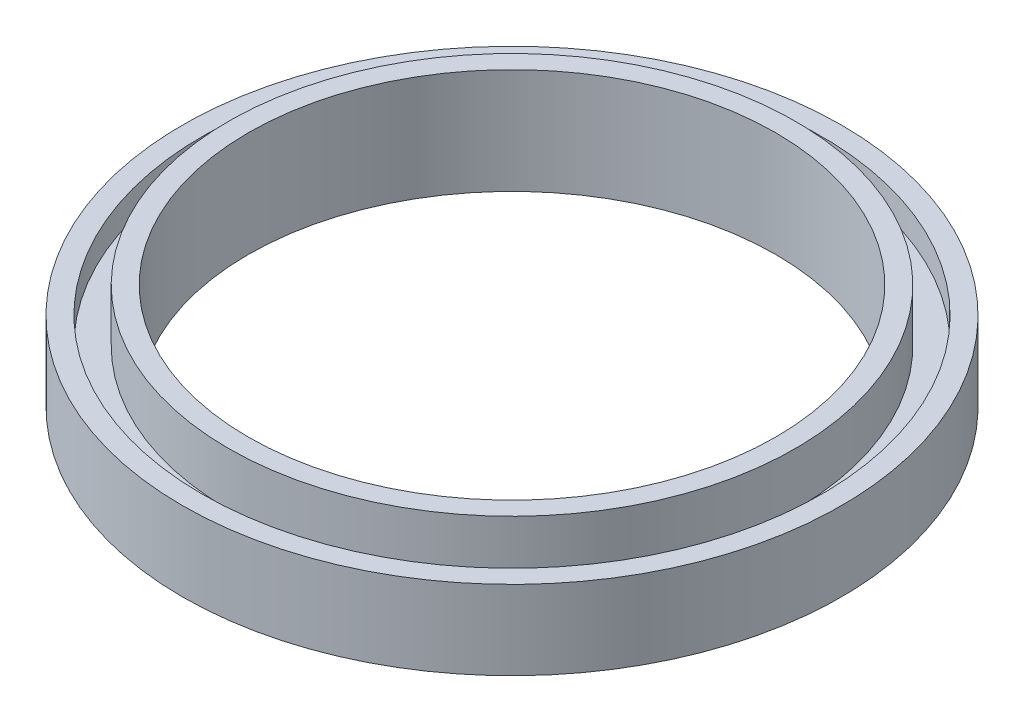
ISO-10303-21;
HEADER;
FILE_DESCRIPTION(('STEP AP214'),'2;1');
FILE_NAME('part.step','',(''),(''),'','','');
FILE_SCHEMA(('AUTOMOTIVE_DESIGN { 1 0 10303 214 1 1 1 1 }'));
ENDSEC;
DATA;
#1=APPLICATION_CONTEXT('core data for automotive mechanical design processes');
#2=APPLICATION_PROTOCOL_DEFINITION('international standard','automotive_design',2000,#1);
#3=PRODUCT_CONTEXT('',#1,'mechanical');
#4=PRODUCT('Part','Part','',(#3));
#5=PRODUCT_RELATED_PRODUCT_CATEGORY('part','',(#4));
#6=PRODUCT_DEFINITION_FORMATION('','',#4);
#7=PRODUCT_DEFINITION_CONTEXT('part definition',#1,'design');
#8=PRODUCT_DEFINITION('design','',#6,#7);
#9=PRODUCT_DEFINITION_SHAPE('','',#8);
#10=(LENGTH_UNIT() NAMED_UNIT(*) SI_UNIT(.MILLI.,.METRE.));
#11=(NAMED_UNIT(*) PLANE_ANGLE_UNIT() SI_UNIT($,.RADIAN.));
#12=(NAMED_UNIT(*) SI_UNIT($,.STERADIAN.) SOLID_ANGLE_UNIT());
#13=UNCERTAINTY_MEASURE_WITH_UNIT(LENGTH_MEASURE(1.E-05),#10,'distance_accuracy_value','');
#14=(GEOMETRIC_REPRESENTATION_CONTEXT(3) GLOBAL_UNCERTAINTY_ASSIGNED_CONTEXT((#13)) GLOBAL_UNIT_ASSIGNED_CONTEXT((#10,
#11,#12)) REPRESENTATION_CONTEXT('',''));
#15=CARTESIAN_POINT('',(0.,0.,0.));
#16=DIRECTION('',(0.,0.,1.));
#17=DIRECTION('',(1.,0.,0.));
#18=AXIS2_PLACEMENT_3D('',#15,#16,#17);
#19=CARTESIAN_POINT('',(0.,4.,0.));
#20=DIRECTION('',(0.,1.,0.));
#21=DIRECTION('',(0.,0.,1.));
#22=AXIS2_PLACEMENT_3D('',#19,#20,#21);
#23=CYLINDRICAL_SURFACE('',#22,23.5);
#24=CARTESIAN_POINT('',(0.,4.,0.));
#25=DIRECTION('',(0.,1.,0.));
#26=DIRECTION('',(0.,0.,1.));
#27=AXIS2_PLACEMENT_3D('',#24,#25,#26);
#28=CIRCLE('',#27,23.5);
#29=CARTESIAN_POINT('',(0.,4.,23.5));
#30=VERTEX_POINT('',#29);
#31=EDGE_CURVE('E44',#30,#30,#28,.T.);
#32=ORIENTED_EDGE('',*,*,#31,.F.);
#33=EDGE_LOOP('',(#32));
#34=FACE_BOUND('',#33,.T.);
#35=CARTESIAN_POINT('',(0.,6.,0.));
#36=DIRECTION('',(0.,1.,0.));
#37=DIRECTION('',(0.,0.,1.));
#38=AXIS2_PLACEMENT_3D('',#35,#36,#37);
#39=CIRCLE('',#38,23.5);
#40=CARTESIAN_POINT('',(0.,6.,23.5));
#41=VERTEX_POINT('',#40);
#42=EDGE_CURVE('E60',#41,#41,#39,.T.);
#43=ORIENTED_EDGE('',*,*,#42,.T.);
#44=EDGE_LOOP('',(#43));
#45=FACE_BOUND('',#44,.T.);
#46=ADVANCED_FACE('F37',(#34,#45),#23,.F.);
#47=CARTESIAN_POINT('',(0.,4.,0.));
#48=DIRECTION('',(0.,1.,0.));
#49=DIRECTION('',(0.,0.,1.));
#50=AXIS2_PLACEMENT_3D('',#47,#48,#49);
#51=PLANE('',#50);
#52=CARTESIAN_POINT('',(0.,4.,0.));
#53=DIRECTION('',(0.,1.,0.));
#54=DIRECTION('',(0.,0.,1.));
#55=AXIS2_PLACEMENT_3D('',#52,#53,#54);
#56=CIRCLE('',#55,21.5);
#57=CARTESIAN_POINT('',(0.,4.,21.5));
#58=VERTEX_POINT('',#57);
#59=EDGE_CURVE('E48',#58,#58,#56,.T.);
#60=ORIENTED_EDGE('',*,*,#59,.F.);
#61=EDGE_LOOP('',(#60));
#62=FACE_BOUND('',#61,.T.);
#63=ORIENTED_EDGE('',*,*,#31,.T.);
#64=EDGE_LOOP('',(#63));
#65=FACE_BOUND('',#64,.T.);
#66=ADVANCED_FACE('F82',(#62,#65),#51,.T.);
#67=CARTESIAN_POINT('',(0.,4.,0.));
#68=DIRECTION('',(0.,1.,0.));
#69=DIRECTION('',(0.,0.,1.));
#70=AXIS2_PLACEMENT_3D('',#67,#68,#69);
#71=CYLINDRICAL_SURFACE('',#70,21.5);
#72=ORIENTED_EDGE('',*,*,#59,.T.);
#73=EDGE_LOOP('',(#72));
#74=FACE_BOUND('',#73,.T.);
#75=CARTESIAN_POINT('',(0.,8.,0.));
#76=DIRECTION('',(0.,1.,0.));
#77=DIRECTION('',(0.,0.,1.));
#78=AXIS2_PLACEMENT_3D('',#75,#76,#77);
#79=CIRCLE('',#78,21.5);
#80=CARTESIAN_POINT('',(0.,8.,21.5));
#81=VERTEX_POINT('',#80);
#82=EDGE_CURVE('E52',#81,#81,#79,.T.);
#83=ORIENTED_EDGE('',*,*,#82,.F.);
#84=EDGE_LOOP('',(#83));
#85=FACE_BOUND('',#84,.T.);
#86=ADVANCED_FACE('F77',(#74,#85),#71,.T.);
#87=CARTESIAN_POINT('',(0.,8.,0.));
#88=DIRECTION('',(0.,1.,0.));
#89=DIRECTION('',(0.,0.,1.));
#90=AXIS2_PLACEMENT_3D('',#87,#88,#89);
#91=PLANE('',#90);
#92=CARTESIAN_POINT('',(0.,8.,0.));
#93=DIRECTION('',(0.,1.,0.));
#94=DIRECTION('',(0.,0.,1.));
#95=AXIS2_PLACEMENT_3D('',#92,#93,#94);
#96=CIRCLE('',#95,20.);
#97=CARTESIAN_POINT('',(0.,8.,20.));
#98=VERTEX_POINT('',#97);
#99=EDGE_CURVE('E66',#98,#98,#96,.T.);
#100=ORIENTED_EDGE('',*,*,#99,.F.);
#101=EDGE_LOOP('',(#100));
#102=FACE_BOUND('',#101,.T.);
#103=ORIENTED_EDGE('',*,*,#82,.T.);
#104=EDGE_LOOP('',(#103));
#105=FACE_BOUND('',#104,.T.);
#106=ADVANCED_FACE('F73',(#102,#105),#91,.T.);
#107=CARTESIAN_POINT('',(0.,6.,0.));
#108=DIRECTION('',(0.,1.,0.));
#109=DIRECTION('',(0.,0.,1.));
#110=AXIS2_PLACEMENT_3D('',#107,#108,#109);
#111=PLANE('',#110);
#112=ORIENTED_EDGE('',*,*,#42,.F.);
#113=EDGE_LOOP('',(#112));
#114=FACE_BOUND('',#113,.T.);
#115=CARTESIAN_POINT('',(0.,6.,0.));
#116=DIRECTION('',(0.,1.,0.));
#117=DIRECTION('',(0.,0.,1.));
#118=AXIS2_PLACEMENT_3D('',#115,#116,#117);
#119=CIRCLE('',#118,25.);
#120=CARTESIAN_POINT('',(0.,6.,25.));
#121=VERTEX_POINT('',#120);
#122=EDGE_CURVE('E56',#121,#121,#119,.T.);
#123=ORIENTED_EDGE('',*,*,#122,.T.);
#124=EDGE_LOOP('',(#123));
#125=FACE_BOUND('',#124,.T.);
#126=ADVANCED_FACE('F76',(#114,#125),#111,.T.);
#127=CARTESIAN_POINT('',(0.,0.,0.));
#128=DIRECTION('',(0.,1.,0.));
#129=DIRECTION('',(0.,0.,1.));
#130=AXIS2_PLACEMENT_3D('',#127,#128,#129);
#131=PLANE('',#130);
#132=CARTESIAN_POINT('',(0.,0.,0.));
#133=DIRECTION('',(0.,1.,0.));
#134=DIRECTION('',(0.,0.,1.));
#135=AXIS2_PLACEMENT_3D('',#132,#133,#134);
#136=CIRCLE('',#135,20.);
#137=CARTESIAN_POINT('',(0.,0.,20.));
#138=VERTEX_POINT('',#137);
#139=EDGE_CURVE('E63',#138,#138,#136,.F.);
#140=ORIENTED_EDGE('',*,*,#139,.F.);
#141=EDGE_LOOP('',(#140));
#142=FACE_BOUND('',#141,.T.);
#143=CARTESIAN_POINT('',(0.,0.,0.));
#144=DIRECTION('',(0.,1.,0.));
#145=DIRECTION('',(0.,0.,1.));
#146=AXIS2_PLACEMENT_3D('',#143,#144,#145);
#147=CIRCLE('',#146,25.);
#148=CARTESIAN_POINT('',(0.,0.,25.));
#149=VERTEX_POINT('',#148);
#150=EDGE_CURVE('E10',#149,#149,#147,.T.);
#151=ORIENTED_EDGE('',*,*,#150,.F.);
#152=EDGE_LOOP('',(#151));
#153=FACE_BOUND('',#152,.T.);
#154=ADVANCED_FACE('F98',(#142,#153),#131,.F.);
#155=CARTESIAN_POINT('',(0.,8.,0.));
#156=DIRECTION('',(0.,-1.,0.));
#157=DIRECTION('',(0.,0.,-1.));
#158=AXIS2_PLACEMENT_3D('',#155,#156,#157);
#159=CYLINDRICAL_SURFACE('',#158,25.);
#160=ORIENTED_EDGE('',*,*,#150,.T.);
#161=EDGE_LOOP('',(#160));
#162=FACE_BOUND('',#161,.T.);
#163=ORIENTED_EDGE('',*,*,#122,.F.);
#164=EDGE_LOOP('',(#163));
#165=FACE_BOUND('',#164,.T.);
#166=ADVANCED_FACE('F39',(#162,#165),#159,.T.);
#167=CARTESIAN_POINT('',(0.,-0.000999999999999265,0.));
#168=DIRECTION('',(0.,1.,0.));
#169=DIRECTION('',(0.,0.,1.));
#170=AXIS2_PLACEMENT_3D('',#167,#168,#169);
#171=CYLINDRICAL_SURFACE('',#170,20.);
#172=ORIENTED_EDGE('',*,*,#99,.T.);
#173=EDGE_LOOP('',(#172));
#174=FACE_BOUND('',#173,.T.);
#175=ORIENTED_EDGE('',*,*,#139,.T.);
#176=EDGE_LOOP('',(#175));
#177=FACE_BOUND('',#176,.T.);
#178=ADVANCED_FACE('F70',(#174,#177),#171,.F.);
#179=CLOSED_SHELL('',(#46,#66,#86,#106,#126,#154,#166,#178));
#180=MANIFOLD_SOLID_BREP('B2',#179);
#181=ADVANCED_BREP_SHAPE_REPRESENTATION('',(#18,#180),#14);
#182=SHAPE_DEFINITION_REPRESENTATION(#9,#181);
ENDSEC;
END-ISO-10303-21;
